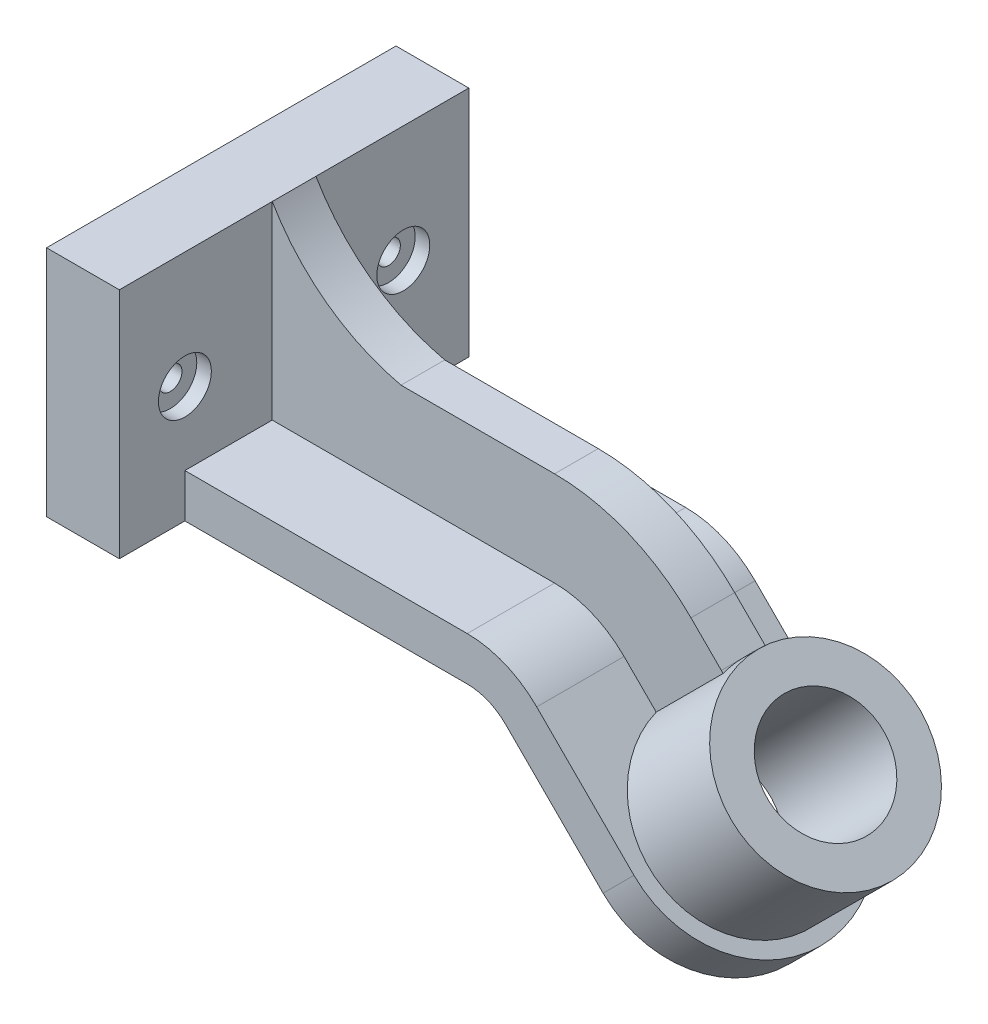
ISO-10303-21;
HEADER;
FILE_DESCRIPTION(('STEP AP214'),'2;1');
FILE_NAME('part.step','',(''),(''),'','','');
FILE_SCHEMA(('AUTOMOTIVE_DESIGN { 1 0 10303 214 1 1 1 1 }'));
ENDSEC;
DATA;
#1=APPLICATION_CONTEXT('core data for automotive mechanical design processes');
#2=APPLICATION_PROTOCOL_DEFINITION('international standard','automotive_design',2000,#1);
#3=PRODUCT_CONTEXT('',#1,'mechanical');
#4=PRODUCT('Part','Part','',(#3));
#5=PRODUCT_RELATED_PRODUCT_CATEGORY('part','',(#4));
#6=PRODUCT_DEFINITION_FORMATION('','',#4);
#7=PRODUCT_DEFINITION_CONTEXT('part definition',#1,'design');
#8=PRODUCT_DEFINITION('design','',#6,#7);
#9=PRODUCT_DEFINITION_SHAPE('','',#8);
#10=(LENGTH_UNIT() NAMED_UNIT(*) SI_UNIT(.MILLI.,.METRE.));
#11=(NAMED_UNIT(*) PLANE_ANGLE_UNIT() SI_UNIT($,.RADIAN.));
#12=(NAMED_UNIT(*) SI_UNIT($,.STERADIAN.) SOLID_ANGLE_UNIT());
#13=UNCERTAINTY_MEASURE_WITH_UNIT(LENGTH_MEASURE(1.E-05),#10,'distance_accuracy_value','');
#14=(GEOMETRIC_REPRESENTATION_CONTEXT(3) GLOBAL_UNCERTAINTY_ASSIGNED_CONTEXT((#13)) GLOBAL_UNIT_ASSIGNED_CONTEXT((#10,
#11,#12)) REPRESENTATION_CONTEXT('',''));
#15=CARTESIAN_POINT('',(0.,0.,0.));
#16=DIRECTION('',(0.,0.,1.));
#17=DIRECTION('',(1.,0.,0.));
#18=AXIS2_PLACEMENT_3D('',#15,#16,#17);
#19=CARTESIAN_POINT('',(44.3725830020305,44.3725830020304,30.));
#20=DIRECTION('',(0.707106781186548,0.707106781186547,0.));
#21=DIRECTION('',(-0.707106781186547,0.707106781186548,0.));
#22=AXIS2_PLACEMENT_3D('',#19,#20,#21);
#23=PLANE('',#22);
#24=DIRECTION('',(0.,0.,-1.));
#25=VECTOR('',#24,1.);
#26=CARTESIAN_POINT('',(116.653282912024,-27.9081169079632,30.));
#27=LINE('',#26,#25);
#28=CARTESIAN_POINT('',(116.653282912024,-27.9081169079632,-6.));
#29=VERTEX_POINT('',#28);
#30=CARTESIAN_POINT('',(116.653282912024,-27.9081169079632,-30.));
#31=VERTEX_POINT('',#30);
#32=EDGE_CURVE('E351',#29,#31,#27,.T.);
#33=ORIENTED_EDGE('',*,*,#32,.F.);
#34=DIRECTION('',(0.707106781186548,-0.707106781186547,0.));
#35=VECTOR('',#34,1.);
#36=CARTESIAN_POINT('',(116.653282912024,-27.9081169079632,-6.));
#37=LINE('',#36,#35);
#38=CARTESIAN_POINT('',(125.484039182032,-36.7388731779713,-6.));
#39=VERTEX_POINT('',#38);
#40=EDGE_CURVE('E300',#29,#39,#37,.T.);
#41=ORIENTED_EDGE('',*,*,#40,.T.);
#42=CARTESIAN_POINT('',(143.372583002031,-54.6274169979696,0.));
#43=DIRECTION('',(0.707106781186548,0.707106781186548,0.));
#44=DIRECTION('',(-0.707106781186548,0.707106781186548,0.));
#45=AXIS2_PLACEMENT_3D('',#42,#43,#44);
#46=CIRCLE('',#45,26.);
#47=CARTESIAN_POINT('',(125.484039182032,-36.7388731779713,6.));
#48=VERTEX_POINT('',#47);
#49=EDGE_CURVE('E291',#48,#39,#46,.T.);
#50=ORIENTED_EDGE('',*,*,#49,.F.);
#51=DIRECTION('',(0.707106781186547,-0.707106781186548,0.));
#52=VECTOR('',#51,1.);
#53=CARTESIAN_POINT('',(124.98780669118,-36.2426406871194,6.));
#54=LINE('',#53,#52);
#55=CARTESIAN_POINT('',(116.653282912024,-27.9081169079632,6.));
#56=VERTEX_POINT('',#55);
#57=EDGE_CURVE('E65',#56,#48,#54,.T.);
#58=ORIENTED_EDGE('',*,*,#57,.F.);
#59=CARTESIAN_POINT('',(116.653282912024,-27.9081169079632,30.));
#60=VERTEX_POINT('',#59);
#61=EDGE_CURVE('E376',#60,#56,#27,.T.);
#62=ORIENTED_EDGE('',*,*,#61,.F.);
#63=DIRECTION('',(0.707106781186547,-0.707106781186548,0.));
#64=VECTOR('',#63,1.);
#65=CARTESIAN_POINT('',(44.3725830020305,44.3725830020304,30.));
#66=LINE('',#65,#64);
#67=CARTESIAN_POINT('',(143.37258300203,-54.6274169979696,30.));
#68=VERTEX_POINT('',#67);
#69=EDGE_CURVE('E347',#60,#68,#66,.T.);
#70=ORIENTED_EDGE('',*,*,#69,.T.);
#71=CARTESIAN_POINT('',(143.37258300203,-54.6274169979696,0.));
#72=DIRECTION('',(0.707106781186548,0.707106781186548,0.));
#73=DIRECTION('',(-0.707106781186548,0.707106781186548,0.));
#74=AXIS2_PLACEMENT_3D('',#71,#72,#73);
#75=CIRCLE('',#74,30.);
#76=CARTESIAN_POINT('',(143.37258300203,-54.6274169979696,-30.));
#77=VERTEX_POINT('',#76);
#78=EDGE_CURVE('E308',#68,#77,#75,.T.);
#79=ORIENTED_EDGE('',*,*,#78,.T.);
#80=DIRECTION('',(0.707106781186547,-0.707106781186548,0.));
#81=VECTOR('',#80,1.);
#82=CARTESIAN_POINT('',(44.3725830020305,44.3725830020305,-30.));
#83=LINE('',#82,#81);
#84=EDGE_CURVE('E330',#31,#77,#83,.T.);
#85=ORIENTED_EDGE('',*,*,#84,.F.);
#86=EDGE_LOOP('',(#33,#41,#50,#58,#62,#70,#79,#85));
#87=FACE_BOUND('',#86,.T.);
#88=ADVANCED_FACE('F49',(#87),#23,.T.);
#89=CARTESIAN_POINT('',(20.,0.,0.));
#90=DIRECTION('',(-1.,0.,0.));
#91=DIRECTION('',(0.,0.,1.));
#92=AXIS2_PLACEMENT_3D('',#89,#90,#91);
#93=PLANE('',#92);
#94=CARTESIAN_POINT('',(20.,0.,-30.));
#95=DIRECTION('',(1.,0.,0.));
#96=DIRECTION('',(0.,0.,-1.));
#97=AXIS2_PLACEMENT_3D('',#94,#95,#96);
#98=CIRCLE('',#97,7.2735);
#99=CARTESIAN_POINT('',(20.,0.,-37.2735));
#100=VERTEX_POINT('',#99);
#101=EDGE_CURVE('E413',#100,#100,#98,.T.);
#102=ORIENTED_EDGE('',*,*,#101,.F.);
#103=EDGE_LOOP('',(#102));
#104=FACE_BOUND('',#103,.T.);
#105=DIRECTION('',(0.,-1.,0.));
#106=VECTOR('',#105,1.);
#107=CARTESIAN_POINT('',(20.,32.,-6.));
#108=LINE('',#107,#106);
#109=CARTESIAN_POINT('',(20.,32.,-6.));
#110=VERTEX_POINT('',#109);
#111=CARTESIAN_POINT('',(20.,-20.,-6.));
#112=VERTEX_POINT('',#111);
#113=EDGE_CURVE('E202',#110,#112,#108,.T.);
#114=ORIENTED_EDGE('',*,*,#113,.T.);
#115=DIRECTION('',(0.,0.,-1.));
#116=VECTOR('',#115,1.);
#117=CARTESIAN_POINT('',(20.,-20.,30.));
#118=LINE('',#117,#116);
#119=CARTESIAN_POINT('',(20.,-20.,-30.));
#120=VERTEX_POINT('',#119);
#121=EDGE_CURVE('E387',#112,#120,#118,.T.);
#122=ORIENTED_EDGE('',*,*,#121,.T.);
#123=DIRECTION('',(0.,-1.,0.));
#124=VECTOR('',#123,1.);
#125=CARTESIAN_POINT('',(20.,0.,-30.));
#126=LINE('',#125,#124);
#127=CARTESIAN_POINT('',(20.,-32.,-30.));
#128=VERTEX_POINT('',#127);
#129=EDGE_CURVE('E359',#120,#128,#126,.T.);
#130=ORIENTED_EDGE('',*,*,#129,.T.);
#131=DIRECTION('',(0.,0.,-1.));
#132=VECTOR('',#131,1.);
#133=CARTESIAN_POINT('',(20.,-32.,48.));
#134=LINE('',#133,#132);
#135=CARTESIAN_POINT('',(20.,-32.,-48.));
#136=VERTEX_POINT('',#135);
#137=EDGE_CURVE('E247',#128,#136,#134,.T.);
#138=ORIENTED_EDGE('',*,*,#137,.T.);
#139=DIRECTION('',(0.,1.,0.));
#140=VECTOR('',#139,1.);
#141=CARTESIAN_POINT('',(20.,-32.,-48.));
#142=LINE('',#141,#140);
#143=CARTESIAN_POINT('',(20.,32.,-48.));
#144=VERTEX_POINT('',#143);
#145=EDGE_CURVE('E240',#136,#144,#142,.T.);
#146=ORIENTED_EDGE('',*,*,#145,.T.);
#147=DIRECTION('',(0.,0.,1.));
#148=VECTOR('',#147,1.);
#149=CARTESIAN_POINT('',(20.,32.,48.));
#150=LINE('',#149,#148);
#151=EDGE_CURVE('E230',#144,#110,#150,.T.);
#152=ORIENTED_EDGE('',*,*,#151,.T.);
#153=EDGE_LOOP('',(#114,#122,#130,#138,#146,#152));
#154=FACE_BOUND('',#153,.T.);
#155=ADVANCED_FACE('F238',(#104,#154),#93,.F.);
#156=CARTESIAN_POINT('',(97.5613998199873,-47.,30.));
#157=DIRECTION('',(0.,0.,-1.));
#158=DIRECTION('',(0.,1.,0.));
#159=AXIS2_PLACEMENT_3D('',#156,#157,#158);
#160=CYLINDRICAL_SURFACE('',#159,27.);
#161=DIRECTION('',(0.,0.,-1.));
#162=VECTOR('',#161,1.);
#163=CARTESIAN_POINT('',(97.5613998199873,-20.,30.));
#164=LINE('',#163,#162);
#165=CARTESIAN_POINT('',(97.5613998199873,-20.,-6.));
#166=VERTEX_POINT('',#165);
#167=CARTESIAN_POINT('',(97.5613998199873,-20.,-30.));
#168=VERTEX_POINT('',#167);
#169=EDGE_CURVE('E392',#166,#168,#164,.T.);
#170=ORIENTED_EDGE('',*,*,#169,.F.);
#171=CARTESIAN_POINT('',(97.5613998199873,-47.,-6.));
#172=DIRECTION('',(0.,0.,-1.));
#173=DIRECTION('',(1.,0.,0.));
#174=AXIS2_PLACEMENT_3D('',#171,#172,#173);
#175=CIRCLE('',#174,27.);
#176=EDGE_CURVE('E515',#166,#29,#175,.T.);
#177=ORIENTED_EDGE('',*,*,#176,.T.);
#178=ORIENTED_EDGE('',*,*,#32,.T.);
#179=CARTESIAN_POINT('',(97.5613998199873,-47.,-30.));
#180=DIRECTION('',(0.,0.,1.));
#181=DIRECTION('',(0.,-1.,0.));
#182=AXIS2_PLACEMENT_3D('',#179,#180,#181);
#183=CIRCLE('',#182,27.);
#184=EDGE_CURVE('E322',#168,#31,#183,.F.);
#185=ORIENTED_EDGE('',*,*,#184,.F.);
#186=EDGE_LOOP('',(#170,#177,#178,#185));
#187=FACE_BOUND('',#186,.T.);
#188=ADVANCED_FACE('F549',(#187),#160,.T.);
#189=CARTESIAN_POINT('',(0.,-20.,30.));
#190=DIRECTION('',(0.,1.,0.));
#191=DIRECTION('',(0.,0.,1.));
#192=AXIS2_PLACEMENT_3D('',#189,#190,#191);
#193=PLANE('',#192);
#194=ORIENTED_EDGE('',*,*,#121,.F.);
#195=DIRECTION('',(1.,0.,0.));
#196=VECTOR('',#195,1.);
#197=CARTESIAN_POINT('',(20.,-20.,-6.));
#198=LINE('',#197,#196);
#199=EDGE_CURVE('E210',#112,#166,#198,.T.);
#200=ORIENTED_EDGE('',*,*,#199,.T.);
#201=ORIENTED_EDGE('',*,*,#169,.T.);
#202=DIRECTION('',(1.,0.,0.));
#203=VECTOR('',#202,1.);
#204=CARTESIAN_POINT('',(0.,-20.,-30.));
#205=LINE('',#204,#203);
#206=EDGE_CURVE('E355',#120,#168,#205,.T.);
#207=ORIENTED_EDGE('',*,*,#206,.F.);
#208=EDGE_LOOP('',(#194,#200,#201,#207));
#209=FACE_BOUND('',#208,.T.);
#210=ADVANCED_FACE('F571',(#209),#193,.T.);
#211=CARTESIAN_POINT('',(166.,-32.0000000000001,0.));
#212=DIRECTION('',(-0.707106781186547,-0.707106781186547,0.));
#213=DIRECTION('',(0.707106781186548,-0.707106781186548,0.));
#214=AXIS2_PLACEMENT_3D('',#211,#212,#213);
#215=CYLINDRICAL_SURFACE('',#214,26.);
#216=CARTESIAN_POINT('',(166.,-32.0000000000001,0.));
#217=DIRECTION('',(0.707106781186548,0.707106781186548,0.));
#218=DIRECTION('',(-0.707106781186548,0.707106781186548,0.));
#219=AXIS2_PLACEMENT_3D('',#216,#217,#218);
#220=CIRCLE('',#219,26.);
#221=CARTESIAN_POINT('',(147.61522368915,-13.6152236891498,0.));
#222=VERTEX_POINT('',#221);
#223=EDGE_CURVE('E302',#222,#222,#220,.T.);
#224=ORIENTED_EDGE('',*,*,#223,.F.);
#225=EDGE_LOOP('',(#224));
#226=FACE_BOUND('',#225,.T.);
#227=DIRECTION('',(-0.707106781186547,-0.707106781186547,0.));
#228=VECTOR('',#227,1.);
#229=CARTESIAN_POINT('',(148.111456180002,-14.1114561800018,-6.));
#230=LINE('',#229,#228);
#231=CARTESIAN_POINT('',(143.872823622234,-18.3500887377699,-6.));
#232=VERTEX_POINT('',#231);
#233=EDGE_CURVE('E12',#232,#39,#230,.T.);
#234=ORIENTED_EDGE('',*,*,#233,.F.);
#235=CARTESIAN_POINT('',(161.905855356375,-36.0941446436246,0.));
#236=DIRECTION('',(0.701372516546695,0.712794916531366,0.));
#237=DIRECTION('',(-0.712794916531366,0.701372516546695,0.));
#238=AXIS2_PLACEMENT_3D('',#235,#236,#237);
#239=ELLIPSE('',#238,26.0008481044343,26.);
#240=CARTESIAN_POINT('',(143.372583002031,-17.8578643762691,0.));
#241=VERTEX_POINT('',#240);
#242=EDGE_CURVE('E488',#232,#241,#239,.T.);
#243=ORIENTED_EDGE('',*,*,#242,.T.);
#244=CARTESIAN_POINT('',(143.872823622234,-18.3500887377699,6.));
#245=VERTEX_POINT('',#244);
#246=EDGE_CURVE('E293',#241,#245,#239,.T.);
#247=ORIENTED_EDGE('',*,*,#246,.T.);
#248=DIRECTION('',(-0.707106781186547,-0.707106781186547,0.));
#249=VECTOR('',#248,1.);
#250=CARTESIAN_POINT('',(148.111456180002,-14.1114561800018,6.));
#251=LINE('',#250,#249);
#252=EDGE_CURVE('E58',#245,#48,#251,.T.);
#253=ORIENTED_EDGE('',*,*,#252,.T.);
#254=ORIENTED_EDGE('',*,*,#49,.T.);
#255=EDGE_LOOP('',(#234,#243,#247,#253,#254));
#256=FACE_BOUND('',#255,.T.);
#257=ADVANCED_FACE('F290',(#226,#256),#215,.T.);
#258=CARTESIAN_POINT('',(35.8873016277917,35.8873016277918,30.));
#259=DIRECTION('',(0.707106781186547,0.707106781186548,0.));
#260=DIRECTION('',(-0.707106781186548,0.707106781186547,0.));
#261=AXIS2_PLACEMENT_3D('',#258,#259,#260);
#262=PLANE('',#261);
#263=CARTESIAN_POINT('',(134.887301627792,-63.1126983722081,0.));
#264=DIRECTION('',(0.707106781186547,0.707106781186548,0.));
#265=DIRECTION('',(-0.707106781186548,0.707106781186547,0.));
#266=AXIS2_PLACEMENT_3D('',#263,#264,#265);
#267=CIRCLE('',#266,16.);
#268=CARTESIAN_POINT('',(123.573593128807,-51.7989898732234,0.));
#269=VERTEX_POINT('',#268);
#270=EDGE_CURVE('E464',#269,#269,#267,.T.);
#271=ORIENTED_EDGE('',*,*,#270,.T.);
#272=EDGE_LOOP('',(#271));
#273=FACE_BOUND('',#272,.T.);
#274=CARTESIAN_POINT('',(134.887301627792,-63.1126983722082,0.));
#275=DIRECTION('',(0.707106781186548,0.707106781186548,0.));
#276=DIRECTION('',(-0.707106781186548,0.707106781186548,0.));
#277=AXIS2_PLACEMENT_3D('',#274,#275,#276);
#278=CIRCLE('',#277,30.);
#279=CARTESIAN_POINT('',(134.887301627792,-63.1126983722082,30.));
#280=VERTEX_POINT('',#279);
#281=CARTESIAN_POINT('',(134.887301627792,-63.1126983722082,-30.));
#282=VERTEX_POINT('',#281);
#283=EDGE_CURVE('E73',#280,#282,#278,.T.);
#284=ORIENTED_EDGE('',*,*,#283,.F.);
#285=DIRECTION('',(0.707106781186548,-0.707106781186547,0.));
#286=VECTOR('',#285,1.);
#287=CARTESIAN_POINT('',(35.8873016277917,35.8873016277918,30.));
#288=LINE('',#287,#286);
#289=CARTESIAN_POINT('',(108.168001537786,-36.3933982822018,30.));
#290=VERTEX_POINT('',#289);
#291=EDGE_CURVE('E343',#290,#280,#288,.T.);
#292=ORIENTED_EDGE('',*,*,#291,.F.);
#293=DIRECTION('',(0.,0.,-1.));
#294=VECTOR('',#293,1.);
#295=CARTESIAN_POINT('',(108.168001537786,-36.3933982822018,30.));
#296=LINE('',#295,#294);
#297=CARTESIAN_POINT('',(108.168001537786,-36.3933982822018,-30.));
#298=VERTEX_POINT('',#297);
#299=EDGE_CURVE('E379',#290,#298,#296,.T.);
#300=ORIENTED_EDGE('',*,*,#299,.T.);
#301=DIRECTION('',(0.707106781186548,-0.707106781186547,0.));
#302=VECTOR('',#301,1.);
#303=CARTESIAN_POINT('',(35.8873016277917,35.8873016277918,-30.));
#304=LINE('',#303,#302);
#305=EDGE_CURVE('E369',#298,#282,#304,.T.);
#306=ORIENTED_EDGE('',*,*,#305,.T.);
#307=EDGE_LOOP('',(#284,#292,#300,#306));
#308=FACE_BOUND('',#307,.T.);
#309=ADVANCED_FACE('F556',(#273,#308),#262,.F.);
#310=CARTESIAN_POINT('',(0.,0.,30.));
#311=DIRECTION('',(0.,0.,1.));
#312=DIRECTION('',(0.,-1.,0.));
#313=AXIS2_PLACEMENT_3D('',#310,#311,#312);
#314=PLANE('',#313);
#315=ORIENTED_EDGE('',*,*,#291,.T.);
#316=DIRECTION('',(0.707106781186547,0.707106781186547,0.));
#317=VECTOR('',#316,1.);
#318=CARTESIAN_POINT('',(134.887301627792,-63.1126983722082,30.));
#319=LINE('',#318,#317);
#320=EDGE_CURVE('E318',#280,#68,#319,.T.);
#321=ORIENTED_EDGE('',*,*,#320,.T.);
#322=ORIENTED_EDGE('',*,*,#69,.F.);
#323=CARTESIAN_POINT('',(97.5613998199873,-47.,30.));
#324=DIRECTION('',(0.,0.,1.));
#325=DIRECTION('',(0.,-1.,0.));
#326=AXIS2_PLACEMENT_3D('',#323,#324,#325);
#327=CIRCLE('',#326,27.);
#328=CARTESIAN_POINT('',(97.5613998199873,-20.,30.));
#329=VERTEX_POINT('',#328);
#330=EDGE_CURVE('E325',#329,#60,#327,.F.);
#331=ORIENTED_EDGE('',*,*,#330,.F.);
#332=DIRECTION('',(1.,0.,0.));
#333=VECTOR('',#332,1.);
#334=CARTESIAN_POINT('',(0.,-20.,30.));
#335=LINE('',#334,#333);
#336=CARTESIAN_POINT('',(20.,-20.,30.));
#337=VERTEX_POINT('',#336);
#338=EDGE_CURVE('E329',#337,#329,#335,.T.);
#339=ORIENTED_EDGE('',*,*,#338,.F.);
#340=DIRECTION('',(0.,-1.,0.));
#341=VECTOR('',#340,1.);
#342=CARTESIAN_POINT('',(20.,0.,30.));
#343=LINE('',#342,#341);
#344=CARTESIAN_POINT('',(20.,-32.,30.));
#345=VERTEX_POINT('',#344);
#346=EDGE_CURVE('E334',#337,#345,#343,.T.);
#347=ORIENTED_EDGE('',*,*,#346,.T.);
#348=DIRECTION('',(1.,0.,0.));
#349=VECTOR('',#348,1.);
#350=CARTESIAN_POINT('',(0.,-32.,30.));
#351=LINE('',#350,#349);
#352=CARTESIAN_POINT('',(97.5613998199873,-32.,30.));
#353=VERTEX_POINT('',#352);
#354=EDGE_CURVE('E337',#345,#353,#351,.T.);
#355=ORIENTED_EDGE('',*,*,#354,.T.);
#356=CARTESIAN_POINT('',(97.5613998199873,-47.,30.));
#357=DIRECTION('',(0.,0.,1.));
#358=DIRECTION('',(0.,-1.,0.));
#359=AXIS2_PLACEMENT_3D('',#356,#357,#358);
#360=CIRCLE('',#359,15.);
#361=EDGE_CURVE('E340',#353,#290,#360,.F.);
#362=ORIENTED_EDGE('',*,*,#361,.T.);
#363=EDGE_LOOP('',(#315,#321,#322,#331,#339,#347,#355,#362));
#364=FACE_BOUND('',#363,.T.);
#365=ADVANCED_FACE('F559',(#364),#314,.T.);
#366=CARTESIAN_POINT('',(0.,0.,-30.));
#367=DIRECTION('',(0.,0.,1.));
#368=DIRECTION('',(0.,-1.,0.));
#369=AXIS2_PLACEMENT_3D('',#366,#367,#368);
#370=PLANE('',#369);
#371=DIRECTION('',(0.707106781186547,0.707106781186547,0.));
#372=VECTOR('',#371,1.);
#373=CARTESIAN_POINT('',(134.887301627792,-63.1126983722082,-30.));
#374=LINE('',#373,#372);
#375=EDGE_CURVE('E315',#282,#77,#374,.T.);
#376=ORIENTED_EDGE('',*,*,#375,.F.);
#377=ORIENTED_EDGE('',*,*,#305,.F.);
#378=CARTESIAN_POINT('',(97.5613998199873,-47.,-30.));
#379=DIRECTION('',(0.,0.,1.));
#380=DIRECTION('',(0.,-1.,0.));
#381=AXIS2_PLACEMENT_3D('',#378,#379,#380);
#382=CIRCLE('',#381,15.);
#383=CARTESIAN_POINT('',(97.5613998199873,-32.,-30.));
#384=VERTEX_POINT('',#383);
#385=EDGE_CURVE('E366',#384,#298,#382,.F.);
#386=ORIENTED_EDGE('',*,*,#385,.F.);
#387=DIRECTION('',(1.,0.,0.));
#388=VECTOR('',#387,1.);
#389=CARTESIAN_POINT('',(0.,-32.,-30.));
#390=LINE('',#389,#388);
#391=EDGE_CURVE('E363',#128,#384,#390,.T.);
#392=ORIENTED_EDGE('',*,*,#391,.F.);
#393=ORIENTED_EDGE('',*,*,#129,.F.);
#394=ORIENTED_EDGE('',*,*,#206,.T.);
#395=ORIENTED_EDGE('',*,*,#184,.T.);
#396=ORIENTED_EDGE('',*,*,#84,.T.);
#397=EDGE_LOOP('',(#376,#377,#386,#392,#393,#394,#395,#396));
#398=FACE_BOUND('',#397,.T.);
#399=ADVANCED_FACE('F554',(#398),#370,.F.);
#400=CARTESIAN_POINT('',(20.,-20.,6.));
#401=VERTEX_POINT('',#400);
#402=EDGE_CURVE('E388',#337,#401,#118,.T.);
#403=ORIENTED_EDGE('',*,*,#402,.T.);
#404=DIRECTION('',(0.,-1.,0.));
#405=VECTOR('',#404,1.);
#406=CARTESIAN_POINT('',(20.,32.,6.));
#407=LINE('',#406,#405);
#408=CARTESIAN_POINT('',(20.,32.,6.));
#409=VERTEX_POINT('',#408);
#410=EDGE_CURVE('E454',#409,#401,#407,.T.);
#411=ORIENTED_EDGE('',*,*,#410,.F.);
#412=CARTESIAN_POINT('',(20.,32.,48.));
#413=VERTEX_POINT('',#412);
#414=EDGE_CURVE('E233',#409,#413,#150,.T.);
#415=ORIENTED_EDGE('',*,*,#414,.T.);
#416=DIRECTION('',(0.,-1.,0.));
#417=VECTOR('',#416,1.);
#418=CARTESIAN_POINT('',(20.,-32.,48.));
#419=LINE('',#418,#417);
#420=CARTESIAN_POINT('',(20.,-32.,48.));
#421=VERTEX_POINT('',#420);
#422=EDGE_CURVE('E243',#413,#421,#419,.T.);
#423=ORIENTED_EDGE('',*,*,#422,.T.);
#424=EDGE_CURVE('E252',#421,#345,#134,.T.);
#425=ORIENTED_EDGE('',*,*,#424,.T.);
#426=ORIENTED_EDGE('',*,*,#346,.F.);
#427=EDGE_LOOP('',(#403,#411,#415,#423,#425,#426));
#428=FACE_BOUND('',#427,.T.);
#429=CARTESIAN_POINT('',(20.,0.,30.));
#430=DIRECTION('',(1.,0.,0.));
#431=DIRECTION('',(0.,0.,-1.));
#432=AXIS2_PLACEMENT_3D('',#429,#430,#431);
#433=CIRCLE('',#432,7.2735);
#434=CARTESIAN_POINT('',(20.,0.,22.7265));
#435=VERTEX_POINT('',#434);
#436=EDGE_CURVE('E397',#435,#435,#433,.T.);
#437=ORIENTED_EDGE('',*,*,#436,.F.);
#438=EDGE_LOOP('',(#437));
#439=FACE_BOUND('',#438,.T.);
#440=ADVANCED_FACE('F450',(#428,#439),#93,.F.);
#441=CARTESIAN_POINT('',(20.,-32.,-48.));
#442=DIRECTION('',(0.,0.,1.));
#443=DIRECTION('',(1.,0.,0.));
#444=AXIS2_PLACEMENT_3D('',#441,#442,#443);
#445=PLANE('',#444);
#446=DIRECTION('',(0.,1.,0.));
#447=VECTOR('',#446,1.);
#448=CARTESIAN_POINT('',(0.,-32.,-48.));
#449=LINE('',#448,#447);
#450=CARTESIAN_POINT('',(0.,-32.,-48.));
#451=VERTEX_POINT('',#450);
#452=CARTESIAN_POINT('',(0.,32.,-48.));
#453=VERTEX_POINT('',#452);
#454=EDGE_CURVE('E257',#451,#453,#449,.T.);
#455=ORIENTED_EDGE('',*,*,#454,.T.);
#456=DIRECTION('',(-1.,0.,0.));
#457=VECTOR('',#456,1.);
#458=CARTESIAN_POINT('',(20.,32.,-48.));
#459=LINE('',#458,#457);
#460=EDGE_CURVE('E282',#144,#453,#459,.T.);
#461=ORIENTED_EDGE('',*,*,#460,.F.);
#462=ORIENTED_EDGE('',*,*,#145,.F.);
#463=DIRECTION('',(-1.,0.,0.));
#464=VECTOR('',#463,1.);
#465=CARTESIAN_POINT('',(20.,-32.,-48.));
#466=LINE('',#465,#464);
#467=EDGE_CURVE('E256',#136,#451,#466,.T.);
#468=ORIENTED_EDGE('',*,*,#467,.T.);
#469=EDGE_LOOP('',(#455,#461,#462,#468));
#470=FACE_BOUND('',#469,.T.);
#471=ADVANCED_FACE('F51',(#470),#445,.F.);
#472=CARTESIAN_POINT('',(20.,32.,48.));
#473=DIRECTION('',(0.,-1.,0.));
#474=DIRECTION('',(0.,0.,-1.));
#475=AXIS2_PLACEMENT_3D('',#472,#473,#474);
#476=PLANE('',#475);
#477=DIRECTION('',(0.,0.,1.));
#478=VECTOR('',#477,1.);
#479=CARTESIAN_POINT('',(0.,32.,48.));
#480=LINE('',#479,#478);
#481=CARTESIAN_POINT('',(0.,32.,48.));
#482=VERTEX_POINT('',#481);
#483=EDGE_CURVE('E261',#453,#482,#480,.T.);
#484=ORIENTED_EDGE('',*,*,#483,.T.);
#485=DIRECTION('',(-1.,0.,0.));
#486=VECTOR('',#485,1.);
#487=CARTESIAN_POINT('',(20.,32.,48.));
#488=LINE('',#487,#486);
#489=EDGE_CURVE('E278',#413,#482,#488,.T.);
#490=ORIENTED_EDGE('',*,*,#489,.F.);
#491=ORIENTED_EDGE('',*,*,#414,.F.);
#492=DIRECTION('',(0.,0.,1.));
#493=VECTOR('',#492,1.);
#494=CARTESIAN_POINT('',(20.,32.,-6.));
#495=LINE('',#494,#493);
#496=EDGE_CURVE('E220',#110,#409,#495,.T.);
#497=ORIENTED_EDGE('',*,*,#496,.F.);
#498=ORIENTED_EDGE('',*,*,#151,.F.);
#499=ORIENTED_EDGE('',*,*,#460,.T.);
#500=EDGE_LOOP('',(#484,#490,#491,#497,#498,#499));
#501=FACE_BOUND('',#500,.T.);
#502=ADVANCED_FACE('F228',(#501),#476,.F.);
#503=CARTESIAN_POINT('',(20.,-32.,48.));
#504=DIRECTION('',(0.,0.,-1.));
#505=DIRECTION('',(-1.,0.,0.));
#506=AXIS2_PLACEMENT_3D('',#503,#504,#505);
#507=PLANE('',#506);
#508=DIRECTION('',(0.,-1.,0.));
#509=VECTOR('',#508,1.);
#510=CARTESIAN_POINT('',(0.,-32.,48.));
#511=LINE('',#510,#509);
#512=CARTESIAN_POINT('',(0.,-32.,48.));
#513=VERTEX_POINT('',#512);
#514=EDGE_CURVE('E265',#482,#513,#511,.T.);
#515=ORIENTED_EDGE('',*,*,#514,.T.);
#516=DIRECTION('',(-1.,0.,0.));
#517=VECTOR('',#516,1.);
#518=CARTESIAN_POINT('',(20.,-32.,48.));
#519=LINE('',#518,#517);
#520=EDGE_CURVE('E274',#421,#513,#519,.T.);
#521=ORIENTED_EDGE('',*,*,#520,.F.);
#522=ORIENTED_EDGE('',*,*,#422,.F.);
#523=ORIENTED_EDGE('',*,*,#489,.T.);
#524=EDGE_LOOP('',(#515,#521,#522,#523));
#525=FACE_BOUND('',#524,.T.);
#526=ADVANCED_FACE('F448',(#525),#507,.F.);
#527=CARTESIAN_POINT('',(20.,-32.,48.));
#528=DIRECTION('',(0.,1.,0.));
#529=DIRECTION('',(0.,0.,1.));
#530=AXIS2_PLACEMENT_3D('',#527,#528,#529);
#531=PLANE('',#530);
#532=DIRECTION('',(0.,0.,-1.));
#533=VECTOR('',#532,1.);
#534=CARTESIAN_POINT('',(0.,-32.,48.));
#535=LINE('',#534,#533);
#536=EDGE_CURVE('E268',#513,#451,#535,.T.);
#537=ORIENTED_EDGE('',*,*,#536,.T.);
#538=ORIENTED_EDGE('',*,*,#467,.F.);
#539=ORIENTED_EDGE('',*,*,#137,.F.);
#540=ORIENTED_EDGE('',*,*,#391,.T.);
#541=DIRECTION('',(0.,0.,-1.));
#542=VECTOR('',#541,1.);
#543=CARTESIAN_POINT('',(97.5613998199873,-32.,30.));
#544=LINE('',#543,#542);
#545=EDGE_CURVE('E383',#353,#384,#544,.T.);
#546=ORIENTED_EDGE('',*,*,#545,.F.);
#547=ORIENTED_EDGE('',*,*,#354,.F.);
#548=ORIENTED_EDGE('',*,*,#424,.F.);
#549=ORIENTED_EDGE('',*,*,#520,.T.);
#550=EDGE_LOOP('',(#537,#538,#539,#540,#546,#547,#548,#549));
#551=FACE_BOUND('',#550,.T.);
#552=ADVANCED_FACE('F433',(#551),#531,.F.);
#553=CARTESIAN_POINT('',(0.,0.,0.));
#554=DIRECTION('',(-1.,0.,0.));
#555=DIRECTION('',(0.,0.,1.));
#556=AXIS2_PLACEMENT_3D('',#553,#554,#555);
#557=PLANE('',#556);
#558=CARTESIAN_POINT('',(0.,0.,30.));
#559=DIRECTION('',(-1.,0.,0.));
#560=DIRECTION('',(0.,0.,1.));
#561=AXIS2_PLACEMENT_3D('',#558,#559,#560);
#562=CIRCLE('',#561,3.2);
#563=CARTESIAN_POINT('',(0.,0.,33.2));
#564=VERTEX_POINT('',#563);
#565=EDGE_CURVE('E409',#564,#564,#562,.T.);
#566=ORIENTED_EDGE('',*,*,#565,.F.);
#567=EDGE_LOOP('',(#566));
#568=FACE_BOUND('',#567,.T.);
#569=CARTESIAN_POINT('',(0.,0.,-30.));
#570=DIRECTION('',(-1.,0.,0.));
#571=DIRECTION('',(0.,0.,1.));
#572=AXIS2_PLACEMENT_3D('',#569,#570,#571);
#573=CIRCLE('',#572,3.2);
#574=CARTESIAN_POINT('',(0.,0.,-26.8));
#575=VERTEX_POINT('',#574);
#576=EDGE_CURVE('E262',#575,#575,#573,.T.);
#577=ORIENTED_EDGE('',*,*,#576,.F.);
#578=EDGE_LOOP('',(#577));
#579=FACE_BOUND('',#578,.T.);
#580=ORIENTED_EDGE('',*,*,#454,.F.);
#581=ORIENTED_EDGE('',*,*,#536,.F.);
#582=ORIENTED_EDGE('',*,*,#514,.F.);
#583=ORIENTED_EDGE('',*,*,#483,.F.);
#584=EDGE_LOOP('',(#580,#581,#582,#583));
#585=FACE_BOUND('',#584,.T.);
#586=ADVANCED_FACE('F430',(#568,#579,#585),#557,.T.);
#587=CARTESIAN_POINT('',(20.,0.,-30.));
#588=DIRECTION('',(1.,0.,0.));
#589=DIRECTION('',(0.,0.,-1.));
#590=AXIS2_PLACEMENT_3D('',#587,#588,#589);
#591=CYLINDRICAL_SURFACE('',#590,3.2);
#592=CARTESIAN_POINT('',(16.,0.,-30.));
#593=DIRECTION('',(1.,0.,0.));
#594=DIRECTION('',(0.,0.,-1.));
#595=AXIS2_PLACEMENT_3D('',#592,#593,#594);
#596=CIRCLE('',#595,3.2);
#597=CARTESIAN_POINT('',(16.,0.,-33.2));
#598=VERTEX_POINT('',#597);
#599=EDGE_CURVE('E421',#598,#598,#596,.T.);
#600=ORIENTED_EDGE('',*,*,#599,.T.);
#601=EDGE_LOOP('',(#600));
#602=FACE_BOUND('',#601,.T.);
#603=ORIENTED_EDGE('',*,*,#576,.T.);
#604=EDGE_LOOP('',(#603));
#605=FACE_BOUND('',#604,.T.);
#606=ADVANCED_FACE('F428',(#602,#605),#591,.F.);
#607=CARTESIAN_POINT('',(16.,3.2,-30.));
#608=DIRECTION('',(-1.,0.,0.));
#609=DIRECTION('',(0.,0.,1.));
#610=AXIS2_PLACEMENT_3D('',#607,#608,#609);
#611=PLANE('',#610);
#612=ORIENTED_EDGE('',*,*,#599,.F.);
#613=EDGE_LOOP('',(#612));
#614=FACE_BOUND('',#613,.T.);
#615=CARTESIAN_POINT('',(16.,0.,-30.));
#616=DIRECTION('',(1.,0.,0.));
#617=DIRECTION('',(0.,0.,-1.));
#618=AXIS2_PLACEMENT_3D('',#615,#616,#617);
#619=CIRCLE('',#618,7.2735);
#620=CARTESIAN_POINT('',(16.,0.,-37.2735));
#621=VERTEX_POINT('',#620);
#622=EDGE_CURVE('E417',#621,#621,#619,.T.);
#623=ORIENTED_EDGE('',*,*,#622,.T.);
#624=EDGE_LOOP('',(#623));
#625=FACE_BOUND('',#624,.T.);
#626=ADVANCED_FACE('F590',(#614,#625),#611,.F.);
#627=CARTESIAN_POINT('',(20.,0.,-30.));
#628=DIRECTION('',(1.,0.,0.));
#629=DIRECTION('',(0.,0.,-1.));
#630=AXIS2_PLACEMENT_3D('',#627,#628,#629);
#631=CYLINDRICAL_SURFACE('',#630,7.2735);
#632=ORIENTED_EDGE('',*,*,#622,.F.);
#633=EDGE_LOOP('',(#632));
#634=FACE_BOUND('',#633,.T.);
#635=ORIENTED_EDGE('',*,*,#101,.T.);
#636=EDGE_LOOP('',(#635));
#637=FACE_BOUND('',#636,.T.);
#638=ADVANCED_FACE('F586',(#634,#637),#631,.F.);
#639=CARTESIAN_POINT('',(20.,0.,30.));
#640=DIRECTION('',(1.,0.,0.));
#641=DIRECTION('',(0.,0.,-1.));
#642=AXIS2_PLACEMENT_3D('',#639,#640,#641);
#643=CYLINDRICAL_SURFACE('',#642,3.2);
#644=CARTESIAN_POINT('',(16.,0.,30.));
#645=DIRECTION('',(1.,0.,0.));
#646=DIRECTION('',(0.,0.,-1.));
#647=AXIS2_PLACEMENT_3D('',#644,#645,#646);
#648=CIRCLE('',#647,3.2);
#649=CARTESIAN_POINT('',(16.,0.,26.8));
#650=VERTEX_POINT('',#649);
#651=EDGE_CURVE('E405',#650,#650,#648,.T.);
#652=ORIENTED_EDGE('',*,*,#651,.T.);
#653=EDGE_LOOP('',(#652));
#654=FACE_BOUND('',#653,.T.);
#655=ORIENTED_EDGE('',*,*,#565,.T.);
#656=EDGE_LOOP('',(#655));
#657=FACE_BOUND('',#656,.T.);
#658=ADVANCED_FACE('F582',(#654,#657),#643,.F.);
#659=CARTESIAN_POINT('',(16.,3.2,30.));
#660=DIRECTION('',(-1.,0.,0.));
#661=DIRECTION('',(0.,0.,1.));
#662=AXIS2_PLACEMENT_3D('',#659,#660,#661);
#663=PLANE('',#662);
#664=ORIENTED_EDGE('',*,*,#651,.F.);
#665=EDGE_LOOP('',(#664));
#666=FACE_BOUND('',#665,.T.);
#667=CARTESIAN_POINT('',(16.,0.,30.));
#668=DIRECTION('',(1.,0.,0.));
#669=DIRECTION('',(0.,0.,-1.));
#670=AXIS2_PLACEMENT_3D('',#667,#668,#669);
#671=CIRCLE('',#670,7.2735);
#672=CARTESIAN_POINT('',(16.,0.,22.7265));
#673=VERTEX_POINT('',#672);
#674=EDGE_CURVE('E401',#673,#673,#671,.T.);
#675=ORIENTED_EDGE('',*,*,#674,.T.);
#676=EDGE_LOOP('',(#675));
#677=FACE_BOUND('',#676,.T.);
#678=ADVANCED_FACE('F578',(#666,#677),#663,.F.);
#679=CARTESIAN_POINT('',(20.,0.,30.));
#680=DIRECTION('',(1.,0.,0.));
#681=DIRECTION('',(0.,0.,-1.));
#682=AXIS2_PLACEMENT_3D('',#679,#680,#681);
#683=CYLINDRICAL_SURFACE('',#682,7.2735);
#684=ORIENTED_EDGE('',*,*,#674,.F.);
#685=EDGE_LOOP('',(#684));
#686=FACE_BOUND('',#685,.T.);
#687=ORIENTED_EDGE('',*,*,#436,.T.);
#688=EDGE_LOOP('',(#687));
#689=FACE_BOUND('',#688,.T.);
#690=ADVANCED_FACE('F574',(#686,#689),#683,.F.);
#691=CARTESIAN_POINT('',(97.5613998199873,-47.,6.));
#692=DIRECTION('',(0.,0.,-1.));
#693=DIRECTION('',(1.,0.,0.));
#694=AXIS2_PLACEMENT_3D('',#691,#692,#693);
#695=CIRCLE('',#694,27.);
#696=CARTESIAN_POINT('',(97.5613998199873,-20.,6.));
#697=VERTEX_POINT('',#696);
#698=EDGE_CURVE('E462',#697,#56,#695,.T.);
#699=ORIENTED_EDGE('',*,*,#698,.F.);
#700=EDGE_CURVE('E393',#329,#697,#164,.T.);
#701=ORIENTED_EDGE('',*,*,#700,.F.);
#702=ORIENTED_EDGE('',*,*,#330,.T.);
#703=ORIENTED_EDGE('',*,*,#61,.T.);
#704=EDGE_LOOP('',(#699,#701,#702,#703));
#705=FACE_BOUND('',#704,.T.);
#706=ADVANCED_FACE('F569',(#705),#160,.T.);
#707=DIRECTION('',(1.,0.,0.));
#708=VECTOR('',#707,1.);
#709=CARTESIAN_POINT('',(20.,-20.,6.));
#710=LINE('',#709,#708);
#711=EDGE_CURVE('E457',#401,#697,#710,.T.);
#712=ORIENTED_EDGE('',*,*,#711,.F.);
#713=ORIENTED_EDGE('',*,*,#402,.F.);
#714=ORIENTED_EDGE('',*,*,#338,.T.);
#715=ORIENTED_EDGE('',*,*,#700,.T.);
#716=EDGE_LOOP('',(#712,#713,#714,#715));
#717=FACE_BOUND('',#716,.T.);
#718=ADVANCED_FACE('F565',(#717),#193,.T.);
#719=CARTESIAN_POINT('',(97.5613998199873,-47.,30.));
#720=DIRECTION('',(0.,0.,-1.));
#721=DIRECTION('',(0.,1.,0.));
#722=AXIS2_PLACEMENT_3D('',#719,#720,#721);
#723=CYLINDRICAL_SURFACE('',#722,15.);
#724=ORIENTED_EDGE('',*,*,#385,.T.);
#725=ORIENTED_EDGE('',*,*,#299,.F.);
#726=ORIENTED_EDGE('',*,*,#361,.F.);
#727=ORIENTED_EDGE('',*,*,#545,.T.);
#728=EDGE_LOOP('',(#724,#725,#726,#727));
#729=FACE_BOUND('',#728,.T.);
#730=ADVANCED_FACE('F561',(#729),#723,.F.);
#731=CARTESIAN_POINT('',(134.887301627792,-63.1126983722082,0.));
#732=DIRECTION('',(0.707106781186547,0.707106781186547,0.));
#733=DIRECTION('',(-0.707106781186548,0.707106781186548,0.));
#734=AXIS2_PLACEMENT_3D('',#731,#732,#733);
#735=CYLINDRICAL_SURFACE('',#734,30.);
#736=ORIENTED_EDGE('',*,*,#283,.T.);
#737=ORIENTED_EDGE('',*,*,#375,.T.);
#738=ORIENTED_EDGE('',*,*,#78,.F.);
#739=ORIENTED_EDGE('',*,*,#320,.F.);
#740=EDGE_LOOP('',(#736,#737,#738,#739));
#741=FACE_BOUND('',#740,.T.);
#742=ADVANCED_FACE('F564',(#741),#735,.T.);
#743=CARTESIAN_POINT('',(166.,-32.0000000000001,0.));
#744=DIRECTION('',(0.707106781186548,0.707106781186548,0.));
#745=DIRECTION('',(-0.707106781186548,0.707106781186548,0.));
#746=AXIS2_PLACEMENT_3D('',#743,#744,#745);
#747=PLANE('',#746);
#748=ORIENTED_EDGE('',*,*,#223,.T.);
#749=EDGE_LOOP('',(#748));
#750=FACE_BOUND('',#749,.T.);
#751=CARTESIAN_POINT('',(166.,-32.0000000000001,0.));
#752=DIRECTION('',(0.707106781186548,0.707106781186548,0.));
#753=DIRECTION('',(-0.707106781186548,0.707106781186548,0.));
#754=AXIS2_PLACEMENT_3D('',#751,#752,#753);
#755=CIRCLE('',#754,16.);
#756=CARTESIAN_POINT('',(154.686291501015,-20.6862915010153,0.));
#757=VERTEX_POINT('',#756);
#758=EDGE_CURVE('E303',#757,#757,#755,.T.);
#759=ORIENTED_EDGE('',*,*,#758,.F.);
#760=EDGE_LOOP('',(#759));
#761=FACE_BOUND('',#760,.T.);
#762=ADVANCED_FACE('F666',(#750,#761),#747,.T.);
#763=CARTESIAN_POINT('',(166.,-32.0000000000001,0.));
#764=DIRECTION('',(-0.707106781186547,-0.707106781186547,0.));
#765=DIRECTION('',(0.707106781186548,-0.707106781186548,0.));
#766=AXIS2_PLACEMENT_3D('',#763,#764,#765);
#767=CYLINDRICAL_SURFACE('',#766,16.);
#768=ORIENTED_EDGE('',*,*,#758,.T.);
#769=EDGE_LOOP('',(#768));
#770=FACE_BOUND('',#769,.T.);
#771=ORIENTED_EDGE('',*,*,#270,.F.);
#772=EDGE_LOOP('',(#771));
#773=FACE_BOUND('',#772,.T.);
#774=ADVANCED_FACE('F670',(#770,#773),#767,.F.);
#775=CARTESIAN_POINT('',(67.5519390837211,59.6371686208642,-6.));
#776=DIRECTION('',(0.,0.,1.));
#777=DIRECTION('',(1.,0.,0.));
#778=AXIS2_PLACEMENT_3D('',#775,#776,#777);
#779=PLANE('',#778);
#780=DIRECTION('',(-0.712794916531366,0.701372516546695,0.));
#781=VECTOR('',#780,1.);
#782=CARTESIAN_POINT('',(143.372583002031,-17.8578643762691,-6.));
#783=LINE('',#782,#781);
#784=CARTESIAN_POINT('',(143.372583002031,-17.8578643762691,-6.));
#785=VERTEX_POINT('',#784);
#786=EDGE_CURVE('E503',#232,#785,#783,.T.);
#787=ORIENTED_EDGE('',*,*,#786,.F.);
#788=ORIENTED_EDGE('',*,*,#233,.T.);
#789=ORIENTED_EDGE('',*,*,#40,.F.);
#790=ORIENTED_EDGE('',*,*,#176,.F.);
#791=ORIENTED_EDGE('',*,*,#199,.F.);
#792=ORIENTED_EDGE('',*,*,#113,.F.);
#793=CARTESIAN_POINT('',(67.5519390837211,59.6371686208642,-6.));
#794=DIRECTION('',(0.,0.,-1.));
#795=DIRECTION('',(1.,0.,0.));
#796=AXIS2_PLACEMENT_3D('',#793,#794,#795);
#797=CIRCLE('',#796,55.);
#798=CARTESIAN_POINT('',(55.3841889902576,6.00000000000003,-6.));
#799=VERTEX_POINT('',#798);
#800=EDGE_CURVE('E207',#799,#110,#797,.T.);
#801=ORIENTED_EDGE('',*,*,#800,.F.);
#802=DIRECTION('',(-1.,0.,0.));
#803=VECTOR('',#802,1.);
#804=CARTESIAN_POINT('',(55.3841889902576,6.00000000000003,-6.));
#805=LINE('',#804,#803);
#806=CARTESIAN_POINT('',(97.5613998199873,6.00000000000001,-6.));
#807=VERTEX_POINT('',#806);
#808=EDGE_CURVE('E236',#807,#799,#805,.T.);
#809=ORIENTED_EDGE('',*,*,#808,.F.);
#810=CARTESIAN_POINT('',(97.5613998199873,-47.,-6.));
#811=DIRECTION('',(0.,0.,1.));
#812=DIRECTION('',(1.,0.,0.));
#813=AXIS2_PLACEMENT_3D('',#810,#811,#812);
#814=CIRCLE('',#813,53.);
#815=CARTESIAN_POINT('',(135.038059222874,-9.52334059711294,-6.));
#816=VERTEX_POINT('',#815);
#817=EDGE_CURVE('E513',#816,#807,#814,.T.);
#818=ORIENTED_EDGE('',*,*,#817,.F.);
#819=DIRECTION('',(-0.707106781186548,0.707106781186547,0.));
#820=VECTOR('',#819,1.);
#821=CARTESIAN_POINT('',(135.038059222874,-9.52334059711294,-6.));
#822=LINE('',#821,#820);
#823=EDGE_CURVE('E508',#785,#816,#822,.T.);
#824=ORIENTED_EDGE('',*,*,#823,.F.);
#825=EDGE_LOOP('',(#787,#788,#789,#790,#791,#792,#801,#809,#818,#824));
#826=FACE_BOUND('',#825,.T.);
#827=ADVANCED_FACE('F205',(#826),#779,.F.);
#828=CARTESIAN_POINT('',(67.5519390837211,59.6371686208642,6.));
#829=DIRECTION('',(0.,0.,1.));
#830=DIRECTION('',(1.,0.,0.));
#831=AXIS2_PLACEMENT_3D('',#828,#829,#830);
#832=PLANE('',#831);
#833=ORIENTED_EDGE('',*,*,#252,.F.);
#834=DIRECTION('',(-0.712794916531366,0.701372516546695,0.));
#835=VECTOR('',#834,1.);
#836=CARTESIAN_POINT('',(143.372583002031,-17.8578643762691,6.));
#837=LINE('',#836,#835);
#838=CARTESIAN_POINT('',(143.372583002031,-17.8578643762691,6.));
#839=VERTEX_POINT('',#838);
#840=EDGE_CURVE('E472',#245,#839,#837,.T.);
#841=ORIENTED_EDGE('',*,*,#840,.T.);
#842=DIRECTION('',(-0.707106781186548,0.707106781186547,0.));
#843=VECTOR('',#842,1.);
#844=CARTESIAN_POINT('',(135.038059222874,-9.52334059711294,6.));
#845=LINE('',#844,#843);
#846=CARTESIAN_POINT('',(135.038059222874,-9.52334059711294,6.));
#847=VERTEX_POINT('',#846);
#848=EDGE_CURVE('E475',#839,#847,#845,.T.);
#849=ORIENTED_EDGE('',*,*,#848,.T.);
#850=CARTESIAN_POINT('',(97.5613998199873,-47.,6.));
#851=DIRECTION('',(0.,0.,1.));
#852=DIRECTION('',(1.,0.,0.));
#853=AXIS2_PLACEMENT_3D('',#850,#851,#852);
#854=CIRCLE('',#853,53.);
#855=CARTESIAN_POINT('',(97.5613998199873,6.00000000000001,6.));
#856=VERTEX_POINT('',#855);
#857=EDGE_CURVE('E479',#847,#856,#854,.T.);
#858=ORIENTED_EDGE('',*,*,#857,.T.);
#859=DIRECTION('',(-1.,0.,0.));
#860=VECTOR('',#859,1.);
#861=CARTESIAN_POINT('',(55.3841889902576,6.00000000000003,6.));
#862=LINE('',#861,#860);
#863=CARTESIAN_POINT('',(55.3841889902576,6.00000000000003,6.));
#864=VERTEX_POINT('',#863);
#865=EDGE_CURVE('E224',#856,#864,#862,.T.);
#866=ORIENTED_EDGE('',*,*,#865,.T.);
#867=CARTESIAN_POINT('',(67.5519390837211,59.6371686208642,6.));
#868=DIRECTION('',(0.,0.,-1.));
#869=DIRECTION('',(1.,0.,0.));
#870=AXIS2_PLACEMENT_3D('',#867,#868,#869);
#871=CIRCLE('',#870,55.);
#872=EDGE_CURVE('E458',#864,#409,#871,.T.);
#873=ORIENTED_EDGE('',*,*,#872,.T.);
#874=ORIENTED_EDGE('',*,*,#410,.T.);
#875=ORIENTED_EDGE('',*,*,#711,.T.);
#876=ORIENTED_EDGE('',*,*,#698,.T.);
#877=ORIENTED_EDGE('',*,*,#57,.T.);
#878=EDGE_LOOP('',(#833,#841,#849,#858,#866,#873,#874,#875,#876,#877));
#879=FACE_BOUND('',#878,.T.);
#880=ADVANCED_FACE('F534',(#879),#832,.T.);
#881=CARTESIAN_POINT('',(143.372583002031,-17.8578643762691,-6.));
#882=DIRECTION('',(0.701372516546695,0.712794916531366,0.));
#883=DIRECTION('',(-0.712794916531366,0.701372516546695,0.));
#884=AXIS2_PLACEMENT_3D('',#881,#882,#883);
#885=PLANE('',#884);
#886=ORIENTED_EDGE('',*,*,#246,.F.);
#887=DIRECTION('',(0.,0.,1.));
#888=VECTOR('',#887,1.);
#889=CARTESIAN_POINT('',(143.372583002031,-17.8578643762691,-6.));
#890=LINE('',#889,#888);
#891=EDGE_CURVE('E235',#241,#839,#890,.T.);
#892=ORIENTED_EDGE('',*,*,#891,.T.);
#893=ORIENTED_EDGE('',*,*,#840,.F.);
#894=EDGE_LOOP('',(#886,#892,#893));
#895=FACE_BOUND('',#894,.T.);
#896=ADVANCED_FACE('F533',(#895),#885,.T.);
#897=CARTESIAN_POINT('',(67.5519390837211,59.6371686208642,-6.));
#898=DIRECTION('',(0.,0.,1.));
#899=DIRECTION('',(1.,0.,0.));
#900=AXIS2_PLACEMENT_3D('',#897,#898,#899);
#901=CYLINDRICAL_SURFACE('',#900,55.);
#902=ORIENTED_EDGE('',*,*,#872,.F.);
#903=DIRECTION('',(0.,0.,1.));
#904=VECTOR('',#903,1.);
#905=CARTESIAN_POINT('',(55.3841889902576,6.00000000000003,-6.));
#906=LINE('',#905,#904);
#907=EDGE_CURVE('E222',#799,#864,#906,.T.);
#908=ORIENTED_EDGE('',*,*,#907,.F.);
#909=ORIENTED_EDGE('',*,*,#800,.T.);
#910=ORIENTED_EDGE('',*,*,#496,.T.);
#911=EDGE_LOOP('',(#902,#908,#909,#910));
#912=FACE_BOUND('',#911,.T.);
#913=ADVANCED_FACE('F219',(#912),#901,.F.);
#914=CARTESIAN_POINT('',(55.3841889902576,6.00000000000003,-6.));
#915=DIRECTION('',(0.,1.,0.));
#916=DIRECTION('',(-1.,0.,0.));
#917=AXIS2_PLACEMENT_3D('',#914,#915,#916);
#918=PLANE('',#917);
#919=ORIENTED_EDGE('',*,*,#865,.F.);
#920=DIRECTION('',(0.,0.,1.));
#921=VECTOR('',#920,1.);
#922=CARTESIAN_POINT('',(97.5613998199873,6.00000000000001,-6.));
#923=LINE('',#922,#921);
#924=EDGE_CURVE('E489',#807,#856,#923,.T.);
#925=ORIENTED_EDGE('',*,*,#924,.F.);
#926=ORIENTED_EDGE('',*,*,#808,.T.);
#927=ORIENTED_EDGE('',*,*,#907,.T.);
#928=EDGE_LOOP('',(#919,#925,#926,#927));
#929=FACE_BOUND('',#928,.T.);
#930=ADVANCED_FACE('F524',(#929),#918,.T.);
#931=CARTESIAN_POINT('',(97.5613998199873,-47.,-6.));
#932=DIRECTION('',(0.,0.,1.));
#933=DIRECTION('',(1.,0.,0.));
#934=AXIS2_PLACEMENT_3D('',#931,#932,#933);
#935=CYLINDRICAL_SURFACE('',#934,53.);
#936=ORIENTED_EDGE('',*,*,#857,.F.);
#937=DIRECTION('',(0.,0.,1.));
#938=VECTOR('',#937,1.);
#939=CARTESIAN_POINT('',(135.038059222874,-9.52334059711294,-6.));
#940=LINE('',#939,#938);
#941=EDGE_CURVE('E492',#816,#847,#940,.T.);
#942=ORIENTED_EDGE('',*,*,#941,.F.);
#943=ORIENTED_EDGE('',*,*,#817,.T.);
#944=ORIENTED_EDGE('',*,*,#924,.T.);
#945=EDGE_LOOP('',(#936,#942,#943,#944));
#946=FACE_BOUND('',#945,.T.);
#947=ADVANCED_FACE('F535',(#946),#935,.T.);
#948=CARTESIAN_POINT('',(135.038059222874,-9.52334059711294,-6.));
#949=DIRECTION('',(0.707106781186547,0.707106781186548,0.));
#950=DIRECTION('',(-0.707106781186548,0.707106781186547,0.));
#951=AXIS2_PLACEMENT_3D('',#948,#949,#950);
#952=PLANE('',#951);
#953=ORIENTED_EDGE('',*,*,#848,.F.);
#954=ORIENTED_EDGE('',*,*,#891,.F.);
#955=EDGE_CURVE('E495',#785,#241,#890,.T.);
#956=ORIENTED_EDGE('',*,*,#955,.F.);
#957=ORIENTED_EDGE('',*,*,#823,.T.);
#958=ORIENTED_EDGE('',*,*,#941,.T.);
#959=EDGE_LOOP('',(#953,#954,#956,#957,#958));
#960=FACE_BOUND('',#959,.T.);
#961=ADVANCED_FACE('F528',(#960),#952,.T.);
#962=ORIENTED_EDGE('',*,*,#242,.F.);
#963=ORIENTED_EDGE('',*,*,#786,.T.);
#964=ORIENTED_EDGE('',*,*,#955,.T.);
#965=EDGE_LOOP('',(#962,#963,#964));
#966=FACE_BOUND('',#965,.T.);
#967=ADVANCED_FACE('F502',(#966),#885,.T.);
#968=CLOSED_SHELL('',(#88,#155,#188,#210,#257,#309,#365,#399,#440,#471,#502,#526,#552,#586,#606,
#626,#638,#658,#678,#690,#706,#718,#730,#742,#762,#774,#827,#880,#896,#913,#930,#947,#961,#967));
#969=MANIFOLD_SOLID_BREP('B2',#968);
#970=ADVANCED_BREP_SHAPE_REPRESENTATION('',(#18,#969),#14);
#971=SHAPE_DEFINITION_REPRESENTATION(#9,#970);
ENDSEC;
END-ISO-10303-21;
